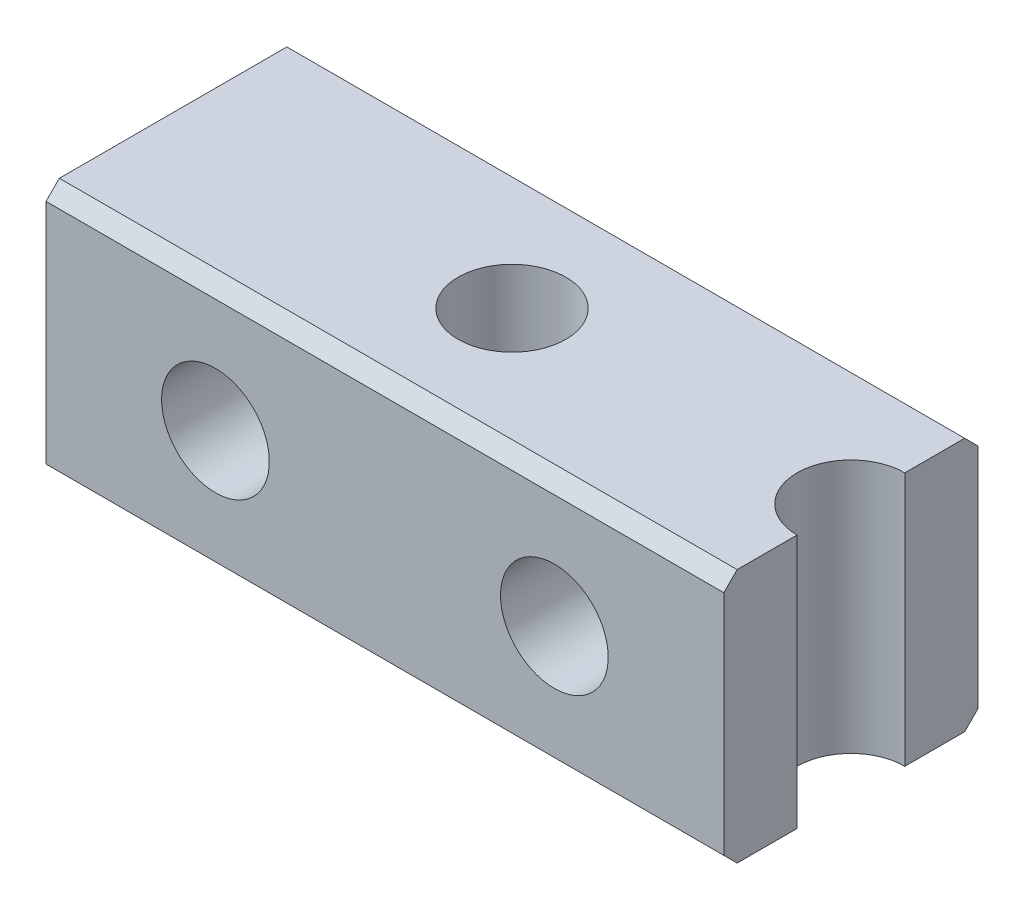
ISO-10303-21;
HEADER;
FILE_DESCRIPTION(('STEP AP214'),'2;1');
FILE_NAME('part.step','',(''),(''),'','','');
FILE_SCHEMA(('AUTOMOTIVE_DESIGN { 1 0 10303 214 1 1 1 1 }'));
ENDSEC;
DATA;
#1=APPLICATION_CONTEXT('core data for automotive mechanical design processes');
#2=APPLICATION_PROTOCOL_DEFINITION('international standard','automotive_design',2000,#1);
#3=PRODUCT_CONTEXT('',#1,'mechanical');
#4=PRODUCT('Part','Part','',(#3));
#5=PRODUCT_RELATED_PRODUCT_CATEGORY('part','',(#4));
#6=PRODUCT_DEFINITION_FORMATION('','',#4);
#7=PRODUCT_DEFINITION_CONTEXT('part definition',#1,'design');
#8=PRODUCT_DEFINITION('design','',#6,#7);
#9=PRODUCT_DEFINITION_SHAPE('','',#8);
#10=(LENGTH_UNIT() NAMED_UNIT(*) SI_UNIT(.MILLI.,.METRE.));
#11=(NAMED_UNIT(*) PLANE_ANGLE_UNIT() SI_UNIT($,.RADIAN.));
#12=(NAMED_UNIT(*) SI_UNIT($,.STERADIAN.) SOLID_ANGLE_UNIT());
#13=UNCERTAINTY_MEASURE_WITH_UNIT(LENGTH_MEASURE(1.E-05),#10,'distance_accuracy_value','');
#14=(GEOMETRIC_REPRESENTATION_CONTEXT(3) GLOBAL_UNCERTAINTY_ASSIGNED_CONTEXT((#13)) GLOBAL_UNIT_ASSIGNED_CONTEXT((#10,
#11,#12)) REPRESENTATION_CONTEXT('',''));
#15=CARTESIAN_POINT('',(0.,0.,0.));
#16=DIRECTION('',(0.,0.,1.));
#17=DIRECTION('',(1.,0.,0.));
#18=AXIS2_PLACEMENT_3D('',#15,#16,#17);
#19=CARTESIAN_POINT('',(12.7,0.,0.));
#20=DIRECTION('',(1.,0.,0.));
#21=DIRECTION('',(0.,1.,0.));
#22=AXIS2_PLACEMENT_3D('',#19,#20,#21);
#23=PLANE('',#22);
#24=DIRECTION('',(0.,1.,0.));
#25=VECTOR('',#24,1.);
#26=CARTESIAN_POINT('',(12.7,-4.7625,2.0193));
#27=LINE('',#26,#25);
#28=CARTESIAN_POINT('',(12.7,4.7625,2.0193));
#29=VERTEX_POINT('',#28);
#30=CARTESIAN_POINT('',(12.7,-4.7625,2.0193));
#31=VERTEX_POINT('',#30);
#32=EDGE_CURVE('E11',#29,#31,#27,.F.);
#33=ORIENTED_EDGE('',*,*,#32,.F.);
#34=DIRECTION('',(0.,0.,-1.));
#35=VECTOR('',#34,1.);
#36=CARTESIAN_POINT('',(12.7,4.7625,-2.13125));
#37=LINE('',#36,#35);
#38=CARTESIAN_POINT('',(12.7,4.7625,4.2625));
#39=VERTEX_POINT('',#38);
#40=EDGE_CURVE('E205',#39,#29,#37,.T.);
#41=ORIENTED_EDGE('',*,*,#40,.F.);
#42=DIRECTION('',(0.,0.707106781186548,-0.707106781186547));
#43=VECTOR('',#42,1.);
#44=CARTESIAN_POINT('',(12.7,4.5125,4.5125));
#45=LINE('',#44,#43);
#46=CARTESIAN_POINT('',(12.7,4.2625,4.7625));
#47=VERTEX_POINT('',#46);
#48=EDGE_CURVE('E201',#47,#39,#45,.T.);
#49=ORIENTED_EDGE('',*,*,#48,.F.);
#50=DIRECTION('',(0.,1.,0.));
#51=VECTOR('',#50,1.);
#52=CARTESIAN_POINT('',(12.7,2.13125,4.7625));
#53=LINE('',#52,#51);
#54=CARTESIAN_POINT('',(12.7,-4.2625,4.7625));
#55=VERTEX_POINT('',#54);
#56=EDGE_CURVE('E197',#55,#47,#53,.T.);
#57=ORIENTED_EDGE('',*,*,#56,.F.);
#58=DIRECTION('',(0.,0.707106781186547,0.707106781186548));
#59=VECTOR('',#58,1.);
#60=CARTESIAN_POINT('',(12.7,-4.5125,4.5125));
#61=LINE('',#60,#59);
#62=CARTESIAN_POINT('',(12.7,-4.7625,4.2625));
#63=VERTEX_POINT('',#62);
#64=EDGE_CURVE('E193',#63,#55,#61,.T.);
#65=ORIENTED_EDGE('',*,*,#64,.F.);
#66=DIRECTION('',(0.,0.,1.));
#67=VECTOR('',#66,1.);
#68=CARTESIAN_POINT('',(12.7,-4.7625,2.13125));
#69=LINE('',#68,#67);
#70=EDGE_CURVE('E192',#31,#63,#69,.T.);
#71=ORIENTED_EDGE('',*,*,#70,.F.);
#72=EDGE_LOOP('',(#33,#41,#49,#57,#65,#71));
#73=FACE_BOUND('',#72,.T.);
#74=ADVANCED_FACE('F17',(#73),#23,.T.);
#75=CARTESIAN_POINT('',(139.7,4.5125,-4.5125));
#76=DIRECTION('',(0.,0.707106781186548,-0.707106781186547));
#77=DIRECTION('',(0.,0.707106781186547,0.707106781186548));
#78=AXIS2_PLACEMENT_3D('',#75,#76,#77);
#79=PLANE('',#78);
#80=DIRECTION('',(0.,-0.707106781186547,-0.707106781186548));
#81=VECTOR('',#80,1.);
#82=CARTESIAN_POINT('',(-12.7,4.5125,-4.5125));
#83=LINE('',#82,#81);
#84=CARTESIAN_POINT('',(-12.7,4.7625,-4.2625));
#85=VERTEX_POINT('',#84);
#86=CARTESIAN_POINT('',(-12.7,4.2625,-4.7625));
#87=VERTEX_POINT('',#86);
#88=EDGE_CURVE('E108',#85,#87,#83,.T.);
#89=ORIENTED_EDGE('',*,*,#88,.F.);
#90=DIRECTION('',(-1.,0.,0.));
#91=VECTOR('',#90,1.);
#92=CARTESIAN_POINT('',(139.7,4.7625,-4.2625));
#93=LINE('',#92,#91);
#94=CARTESIAN_POINT('',(12.7,4.7625,-4.2625));
#95=VERTEX_POINT('',#94);
#96=EDGE_CURVE('E93',#95,#85,#93,.T.);
#97=ORIENTED_EDGE('',*,*,#96,.F.);
#98=DIRECTION('',(0.,-0.707106781186547,-0.707106781186548));
#99=VECTOR('',#98,1.);
#100=CARTESIAN_POINT('',(12.7,4.5125,-4.5125));
#101=LINE('',#100,#99);
#102=CARTESIAN_POINT('',(12.7,4.2625,-4.7625));
#103=VERTEX_POINT('',#102);
#104=EDGE_CURVE('E148',#95,#103,#101,.T.);
#105=ORIENTED_EDGE('',*,*,#104,.T.);
#106=DIRECTION('',(-1.,0.,0.));
#107=VECTOR('',#106,1.);
#108=CARTESIAN_POINT('',(139.7,4.2625,-4.7625));
#109=LINE('',#108,#107);
#110=EDGE_CURVE('E110',#103,#87,#109,.T.);
#111=ORIENTED_EDGE('',*,*,#110,.T.);
#112=EDGE_LOOP('',(#89,#97,#105,#111));
#113=FACE_BOUND('',#112,.T.);
#114=ADVANCED_FACE('F109',(#113),#79,.T.);
#115=CARTESIAN_POINT('',(139.7,4.7625,-2.13125));
#116=DIRECTION('',(0.,1.,0.));
#117=DIRECTION('',(0.,0.,1.));
#118=AXIS2_PLACEMENT_3D('',#115,#116,#117);
#119=PLANE('',#118);
#120=CARTESIAN_POINT('',(0.,4.7625,0.));
#121=DIRECTION('',(0.,1.,0.));
#122=DIRECTION('',(0.,0.,1.));
#123=AXIS2_PLACEMENT_3D('',#120,#121,#122);
#124=CIRCLE('',#123,2.0193);
#125=CARTESIAN_POINT('',(0.,4.7625,2.0193));
#126=VERTEX_POINT('',#125);
#127=EDGE_CURVE('E115',#126,#126,#124,.F.);
#128=ORIENTED_EDGE('',*,*,#127,.T.);
#129=EDGE_LOOP('',(#128));
#130=FACE_BOUND('',#129,.T.);
#131=DIRECTION('',(0.,0.,-1.));
#132=VECTOR('',#131,1.);
#133=CARTESIAN_POINT('',(-12.7,4.7625,-2.13125));
#134=LINE('',#133,#132);
#135=CARTESIAN_POINT('',(-12.7,4.7625,4.2625));
#136=VERTEX_POINT('',#135);
#137=EDGE_CURVE('E97',#136,#85,#134,.T.);
#138=ORIENTED_EDGE('',*,*,#137,.F.);
#139=DIRECTION('',(-1.,0.,0.));
#140=VECTOR('',#139,1.);
#141=CARTESIAN_POINT('',(139.7,4.7625,4.2625));
#142=LINE('',#141,#140);
#143=EDGE_CURVE('E105',#39,#136,#142,.T.);
#144=ORIENTED_EDGE('',*,*,#143,.F.);
#145=ORIENTED_EDGE('',*,*,#40,.T.);
#146=CARTESIAN_POINT('',(12.7,4.7625,0.));
#147=DIRECTION('',(0.,1.,0.));
#148=DIRECTION('',(0.,0.,1.));
#149=AXIS2_PLACEMENT_3D('',#146,#147,#148);
#150=CIRCLE('',#149,2.0193);
#151=CARTESIAN_POINT('',(12.7,4.7625,-2.0193));
#152=VERTEX_POINT('',#151);
#153=EDGE_CURVE('E242',#29,#152,#150,.F.);
#154=ORIENTED_EDGE('',*,*,#153,.T.);
#155=EDGE_CURVE('E100',#152,#95,#37,.T.);
#156=ORIENTED_EDGE('',*,*,#155,.T.);
#157=ORIENTED_EDGE('',*,*,#96,.T.);
#158=EDGE_LOOP('',(#138,#144,#145,#154,#156,#157));
#159=FACE_BOUND('',#158,.T.);
#160=ADVANCED_FACE('F95',(#130,#159),#119,.T.);
#161=CARTESIAN_POINT('',(139.7,4.5125,4.5125));
#162=DIRECTION('',(0.,0.707106781186547,0.707106781186548));
#163=DIRECTION('',(0.,-0.707106781186548,0.707106781186547));
#164=AXIS2_PLACEMENT_3D('',#161,#162,#163);
#165=PLANE('',#164);
#166=DIRECTION('',(0.,0.707106781186548,-0.707106781186547));
#167=VECTOR('',#166,1.);
#168=CARTESIAN_POINT('',(-12.7,4.5125,4.5125));
#169=LINE('',#168,#167);
#170=CARTESIAN_POINT('',(-12.7,4.2625,4.7625));
#171=VERTEX_POINT('',#170);
#172=EDGE_CURVE('E120',#171,#136,#169,.T.);
#173=ORIENTED_EDGE('',*,*,#172,.F.);
#174=DIRECTION('',(-1.,0.,0.));
#175=VECTOR('',#174,1.);
#176=CARTESIAN_POINT('',(139.7,4.2625,4.7625));
#177=LINE('',#176,#175);
#178=EDGE_CURVE('E164',#47,#171,#177,.T.);
#179=ORIENTED_EDGE('',*,*,#178,.F.);
#180=ORIENTED_EDGE('',*,*,#48,.T.);
#181=ORIENTED_EDGE('',*,*,#143,.T.);
#182=EDGE_LOOP('',(#173,#179,#180,#181));
#183=FACE_BOUND('',#182,.T.);
#184=ADVANCED_FACE('F236',(#183),#165,.T.);
#185=CARTESIAN_POINT('',(139.7,2.13125,4.7625));
#186=DIRECTION('',(0.,0.,1.));
#187=DIRECTION('',(1.,0.,0.));
#188=AXIS2_PLACEMENT_3D('',#185,#186,#187);
#189=PLANE('',#188);
#190=CARTESIAN_POINT('',(-6.35,0.,4.7625));
#191=DIRECTION('',(0.,0.,-1.));
#192=DIRECTION('',(-1.,0.,0.));
#193=AXIS2_PLACEMENT_3D('',#190,#191,#192);
#194=CIRCLE('',#193,2.0193);
#195=CARTESIAN_POINT('',(-8.3693,0.,4.7625));
#196=VERTEX_POINT('',#195);
#197=EDGE_CURVE('E174',#196,#196,#194,.T.);
#198=ORIENTED_EDGE('',*,*,#197,.T.);
#199=EDGE_LOOP('',(#198));
#200=FACE_BOUND('',#199,.T.);
#201=CARTESIAN_POINT('',(6.35,0.,4.7625));
#202=DIRECTION('',(0.,0.,-1.));
#203=DIRECTION('',(-1.,0.,0.));
#204=AXIS2_PLACEMENT_3D('',#201,#202,#203);
#205=CIRCLE('',#204,2.0193);
#206=CARTESIAN_POINT('',(4.3307,0.,4.7625));
#207=VERTEX_POINT('',#206);
#208=EDGE_CURVE('E251',#207,#207,#205,.T.);
#209=ORIENTED_EDGE('',*,*,#208,.T.);
#210=EDGE_LOOP('',(#209));
#211=FACE_BOUND('',#210,.T.);
#212=DIRECTION('',(0.,1.,0.));
#213=VECTOR('',#212,1.);
#214=CARTESIAN_POINT('',(-12.7,2.13125,4.7625));
#215=LINE('',#214,#213);
#216=CARTESIAN_POINT('',(-12.7,-4.2625,4.7625));
#217=VERTEX_POINT('',#216);
#218=EDGE_CURVE('E127',#217,#171,#215,.T.);
#219=ORIENTED_EDGE('',*,*,#218,.F.);
#220=DIRECTION('',(-1.,0.,0.));
#221=VECTOR('',#220,1.);
#222=CARTESIAN_POINT('',(139.7,-4.2625,4.7625));
#223=LINE('',#222,#221);
#224=EDGE_CURVE('E161',#55,#217,#223,.T.);
#225=ORIENTED_EDGE('',*,*,#224,.F.);
#226=ORIENTED_EDGE('',*,*,#56,.T.);
#227=ORIENTED_EDGE('',*,*,#178,.T.);
#228=EDGE_LOOP('',(#219,#225,#226,#227));
#229=FACE_BOUND('',#228,.T.);
#230=ADVANCED_FACE('F233',(#200,#211,#229),#189,.T.);
#231=CARTESIAN_POINT('',(139.7,-4.5125,4.5125));
#232=DIRECTION('',(0.,-0.707106781186548,0.707106781186547));
#233=DIRECTION('',(0.,-0.707106781186547,-0.707106781186548));
#234=AXIS2_PLACEMENT_3D('',#231,#232,#233);
#235=PLANE('',#234);
#236=DIRECTION('',(0.,0.707106781186547,0.707106781186548));
#237=VECTOR('',#236,1.);
#238=CARTESIAN_POINT('',(-12.7,-4.5125,4.5125));
#239=LINE('',#238,#237);
#240=CARTESIAN_POINT('',(-12.7,-4.7625,4.2625));
#241=VERTEX_POINT('',#240);
#242=EDGE_CURVE('E133',#241,#217,#239,.T.);
#243=ORIENTED_EDGE('',*,*,#242,.F.);
#244=DIRECTION('',(-1.,0.,0.));
#245=VECTOR('',#244,1.);
#246=CARTESIAN_POINT('',(139.7,-4.7625,4.2625));
#247=LINE('',#246,#245);
#248=EDGE_CURVE('E158',#63,#241,#247,.T.);
#249=ORIENTED_EDGE('',*,*,#248,.F.);
#250=ORIENTED_EDGE('',*,*,#64,.T.);
#251=ORIENTED_EDGE('',*,*,#224,.T.);
#252=EDGE_LOOP('',(#243,#249,#250,#251));
#253=FACE_BOUND('',#252,.T.);
#254=ADVANCED_FACE('F229',(#253),#235,.T.);
#255=CARTESIAN_POINT('',(139.7,-4.7625,2.13125));
#256=DIRECTION('',(0.,-1.,0.));
#257=DIRECTION('',(0.,0.,-1.));
#258=AXIS2_PLACEMENT_3D('',#255,#256,#257);
#259=PLANE('',#258);
#260=CARTESIAN_POINT('',(0.,-4.7625,0.));
#261=DIRECTION('',(0.,1.,0.));
#262=DIRECTION('',(0.,0.,1.));
#263=AXIS2_PLACEMENT_3D('',#260,#261,#262);
#264=CIRCLE('',#263,2.0193);
#265=CARTESIAN_POINT('',(0.,-4.7625,2.0193));
#266=VERTEX_POINT('',#265);
#267=EDGE_CURVE('E215',#266,#266,#264,.T.);
#268=ORIENTED_EDGE('',*,*,#267,.T.);
#269=EDGE_LOOP('',(#268));
#270=FACE_BOUND('',#269,.T.);
#271=DIRECTION('',(0.,0.,1.));
#272=VECTOR('',#271,1.);
#273=CARTESIAN_POINT('',(-12.7,-4.7625,2.13125));
#274=LINE('',#273,#272);
#275=CARTESIAN_POINT('',(-12.7,-4.7625,-4.2625));
#276=VERTEX_POINT('',#275);
#277=EDGE_CURVE('E137',#276,#241,#274,.T.);
#278=ORIENTED_EDGE('',*,*,#277,.F.);
#279=DIRECTION('',(-1.,0.,0.));
#280=VECTOR('',#279,1.);
#281=CARTESIAN_POINT('',(139.7,-4.7625,-4.2625));
#282=LINE('',#281,#280);
#283=CARTESIAN_POINT('',(12.7,-4.7625,-4.2625));
#284=VERTEX_POINT('',#283);
#285=EDGE_CURVE('E155',#284,#276,#282,.T.);
#286=ORIENTED_EDGE('',*,*,#285,.F.);
#287=CARTESIAN_POINT('',(12.7,-4.7625,-2.0193));
#288=VERTEX_POINT('',#287);
#289=EDGE_CURVE('E188',#284,#288,#69,.T.);
#290=ORIENTED_EDGE('',*,*,#289,.T.);
#291=CARTESIAN_POINT('',(12.7,-4.7625,0.));
#292=DIRECTION('',(0.,1.,0.));
#293=DIRECTION('',(0.,0.,1.));
#294=AXIS2_PLACEMENT_3D('',#291,#292,#293);
#295=CIRCLE('',#294,2.0193);
#296=EDGE_CURVE('E178',#288,#31,#295,.T.);
#297=ORIENTED_EDGE('',*,*,#296,.T.);
#298=ORIENTED_EDGE('',*,*,#70,.T.);
#299=ORIENTED_EDGE('',*,*,#248,.T.);
#300=EDGE_LOOP('',(#278,#286,#290,#297,#298,#299));
#301=FACE_BOUND('',#300,.T.);
#302=ADVANCED_FACE('F218',(#270,#301),#259,.T.);
#303=CARTESIAN_POINT('',(139.7,-4.5125,-4.5125));
#304=DIRECTION('',(0.,-0.707106781186547,-0.707106781186548));
#305=DIRECTION('',(0.,0.707106781186548,-0.707106781186547));
#306=AXIS2_PLACEMENT_3D('',#303,#304,#305);
#307=PLANE('',#306);
#308=DIRECTION('',(0.,-0.707106781186548,0.707106781186547));
#309=VECTOR('',#308,1.);
#310=CARTESIAN_POINT('',(-12.7,-4.5125,-4.5125));
#311=LINE('',#310,#309);
#312=CARTESIAN_POINT('',(-12.7,-4.2625,-4.7625));
#313=VERTEX_POINT('',#312);
#314=EDGE_CURVE('E141',#313,#276,#311,.T.);
#315=ORIENTED_EDGE('',*,*,#314,.F.);
#316=DIRECTION('',(-1.,0.,0.));
#317=VECTOR('',#316,1.);
#318=CARTESIAN_POINT('',(139.7,-4.2625,-4.7625));
#319=LINE('',#318,#317);
#320=CARTESIAN_POINT('',(12.7,-4.2625,-4.7625));
#321=VERTEX_POINT('',#320);
#322=EDGE_CURVE('E151',#321,#313,#319,.T.);
#323=ORIENTED_EDGE('',*,*,#322,.F.);
#324=DIRECTION('',(0.,-0.707106781186548,0.707106781186547));
#325=VECTOR('',#324,1.);
#326=CARTESIAN_POINT('',(12.7,-4.5125,-4.5125));
#327=LINE('',#326,#325);
#328=EDGE_CURVE('E184',#321,#284,#327,.T.);
#329=ORIENTED_EDGE('',*,*,#328,.T.);
#330=ORIENTED_EDGE('',*,*,#285,.T.);
#331=EDGE_LOOP('',(#315,#323,#329,#330));
#332=FACE_BOUND('',#331,.T.);
#333=ADVANCED_FACE('F221',(#332),#307,.T.);
#334=CARTESIAN_POINT('',(139.7,-2.13125,-4.7625));
#335=DIRECTION('',(0.,0.,-1.));
#336=DIRECTION('',(-1.,0.,0.));
#337=AXIS2_PLACEMENT_3D('',#334,#335,#336);
#338=PLANE('',#337);
#339=CARTESIAN_POINT('',(-6.35,0.,-4.7625));
#340=DIRECTION('',(0.,0.,-1.));
#341=DIRECTION('',(-1.,0.,0.));
#342=AXIS2_PLACEMENT_3D('',#339,#340,#341);
#343=CIRCLE('',#342,2.0193);
#344=CARTESIAN_POINT('',(-8.3693,0.,-4.7625));
#345=VERTEX_POINT('',#344);
#346=EDGE_CURVE('E173',#345,#345,#343,.F.);
#347=ORIENTED_EDGE('',*,*,#346,.T.);
#348=EDGE_LOOP('',(#347));
#349=FACE_BOUND('',#348,.T.);
#350=CARTESIAN_POINT('',(6.35,0.,-4.7625));
#351=DIRECTION('',(0.,0.,-1.));
#352=DIRECTION('',(-1.,0.,0.));
#353=AXIS2_PLACEMENT_3D('',#350,#351,#352);
#354=CIRCLE('',#353,2.0193);
#355=CARTESIAN_POINT('',(4.3307,0.,-4.7625));
#356=VERTEX_POINT('',#355);
#357=EDGE_CURVE('E169',#356,#356,#354,.F.);
#358=ORIENTED_EDGE('',*,*,#357,.T.);
#359=EDGE_LOOP('',(#358));
#360=FACE_BOUND('',#359,.T.);
#361=DIRECTION('',(0.,-1.,0.));
#362=VECTOR('',#361,1.);
#363=CARTESIAN_POINT('',(-12.7,-2.13125,-4.7625));
#364=LINE('',#363,#362);
#365=EDGE_CURVE('E145',#87,#313,#364,.T.);
#366=ORIENTED_EDGE('',*,*,#365,.F.);
#367=ORIENTED_EDGE('',*,*,#110,.F.);
#368=DIRECTION('',(0.,-1.,0.));
#369=VECTOR('',#368,1.);
#370=CARTESIAN_POINT('',(12.7,-2.13125,-4.7625));
#371=LINE('',#370,#369);
#372=EDGE_CURVE('E152',#103,#321,#371,.T.);
#373=ORIENTED_EDGE('',*,*,#372,.T.);
#374=ORIENTED_EDGE('',*,*,#322,.T.);
#375=EDGE_LOOP('',(#366,#367,#373,#374));
#376=FACE_BOUND('',#375,.T.);
#377=ADVANCED_FACE('F224',(#349,#360,#376),#338,.T.);
#378=ORIENTED_EDGE('',*,*,#155,.F.);
#379=DIRECTION('',(0.,1.,0.));
#380=VECTOR('',#379,1.);
#381=CARTESIAN_POINT('',(12.7,-4.7625,-2.0193));
#382=LINE('',#381,#380);
#383=EDGE_CURVE('E26',#152,#288,#382,.F.);
#384=ORIENTED_EDGE('',*,*,#383,.T.);
#385=ORIENTED_EDGE('',*,*,#289,.F.);
#386=ORIENTED_EDGE('',*,*,#328,.F.);
#387=ORIENTED_EDGE('',*,*,#372,.F.);
#388=ORIENTED_EDGE('',*,*,#104,.F.);
#389=EDGE_LOOP('',(#378,#384,#385,#386,#387,#388));
#390=FACE_BOUND('',#389,.T.);
#391=ADVANCED_FACE('F19',(#390),#23,.T.);
#392=CARTESIAN_POINT('',(-12.7,0.,0.));
#393=DIRECTION('',(1.,0.,0.));
#394=DIRECTION('',(0.,1.,0.));
#395=AXIS2_PLACEMENT_3D('',#392,#393,#394);
#396=PLANE('',#395);
#397=ORIENTED_EDGE('',*,*,#88,.T.);
#398=ORIENTED_EDGE('',*,*,#365,.T.);
#399=ORIENTED_EDGE('',*,*,#314,.T.);
#400=ORIENTED_EDGE('',*,*,#277,.T.);
#401=ORIENTED_EDGE('',*,*,#242,.T.);
#402=ORIENTED_EDGE('',*,*,#218,.T.);
#403=ORIENTED_EDGE('',*,*,#172,.T.);
#404=ORIENTED_EDGE('',*,*,#137,.T.);
#405=EDGE_LOOP('',(#397,#398,#399,#400,#401,#402,#403,#404));
#406=FACE_BOUND('',#405,.T.);
#407=ADVANCED_FACE('F117',(#406),#396,.F.);
#408=CARTESIAN_POINT('',(12.7,-4.7625,0.));
#409=DIRECTION('',(0.,1.,0.));
#410=DIRECTION('',(0.,0.,1.));
#411=AXIS2_PLACEMENT_3D('',#408,#409,#410);
#412=CYLINDRICAL_SURFACE('',#411,2.0193);
#413=ORIENTED_EDGE('',*,*,#153,.F.);
#414=ORIENTED_EDGE('',*,*,#32,.T.);
#415=ORIENTED_EDGE('',*,*,#296,.F.);
#416=ORIENTED_EDGE('',*,*,#383,.F.);
#417=EDGE_LOOP('',(#413,#414,#415,#416));
#418=FACE_BOUND('',#417,.T.);
#419=ADVANCED_FACE('F212',(#418),#412,.F.);
#420=CARTESIAN_POINT('',(0.,-4.7625,0.));
#421=DIRECTION('',(0.,1.,0.));
#422=DIRECTION('',(0.,0.,1.));
#423=AXIS2_PLACEMENT_3D('',#420,#421,#422);
#424=CYLINDRICAL_SURFACE('',#423,2.0193);
#425=ORIENTED_EDGE('',*,*,#127,.F.);
#426=EDGE_LOOP('',(#425));
#427=FACE_BOUND('',#426,.T.);
#428=ORIENTED_EDGE('',*,*,#267,.F.);
#429=EDGE_LOOP('',(#428));
#430=FACE_BOUND('',#429,.T.);
#431=ADVANCED_FACE('F269',(#427,#430),#424,.F.);
#432=CARTESIAN_POINT('',(6.35,0.,4.7625));
#433=DIRECTION('',(0.,0.,-1.));
#434=DIRECTION('',(-1.,0.,0.));
#435=AXIS2_PLACEMENT_3D('',#432,#433,#434);
#436=CYLINDRICAL_SURFACE('',#435,2.0193);
#437=ORIENTED_EDGE('',*,*,#357,.F.);
#438=EDGE_LOOP('',(#437));
#439=FACE_BOUND('',#438,.T.);
#440=ORIENTED_EDGE('',*,*,#208,.F.);
#441=EDGE_LOOP('',(#440));
#442=FACE_BOUND('',#441,.T.);
#443=ADVANCED_FACE('F263',(#439,#442),#436,.F.);
#444=CARTESIAN_POINT('',(-6.35,0.,4.7625));
#445=DIRECTION('',(0.,0.,-1.));
#446=DIRECTION('',(-1.,0.,0.));
#447=AXIS2_PLACEMENT_3D('',#444,#445,#446);
#448=CYLINDRICAL_SURFACE('',#447,2.0193);
#449=ORIENTED_EDGE('',*,*,#346,.F.);
#450=EDGE_LOOP('',(#449));
#451=FACE_BOUND('',#450,.T.);
#452=ORIENTED_EDGE('',*,*,#197,.F.);
#453=EDGE_LOOP('',(#452));
#454=FACE_BOUND('',#453,.T.);
#455=ADVANCED_FACE('F261',(#451,#454),#448,.F.);
#456=CLOSED_SHELL('',(#74,#114,#160,#184,#230,#254,#302,#333,#377,#391,#407,#419,#431,#443,#455));
#457=MANIFOLD_SOLID_BREP('B1',#456);
#458=ADVANCED_BREP_SHAPE_REPRESENTATION('',(#18,#457),#14);
#459=SHAPE_DEFINITION_REPRESENTATION(#9,#458);
ENDSEC;
END-ISO-10303-21;
